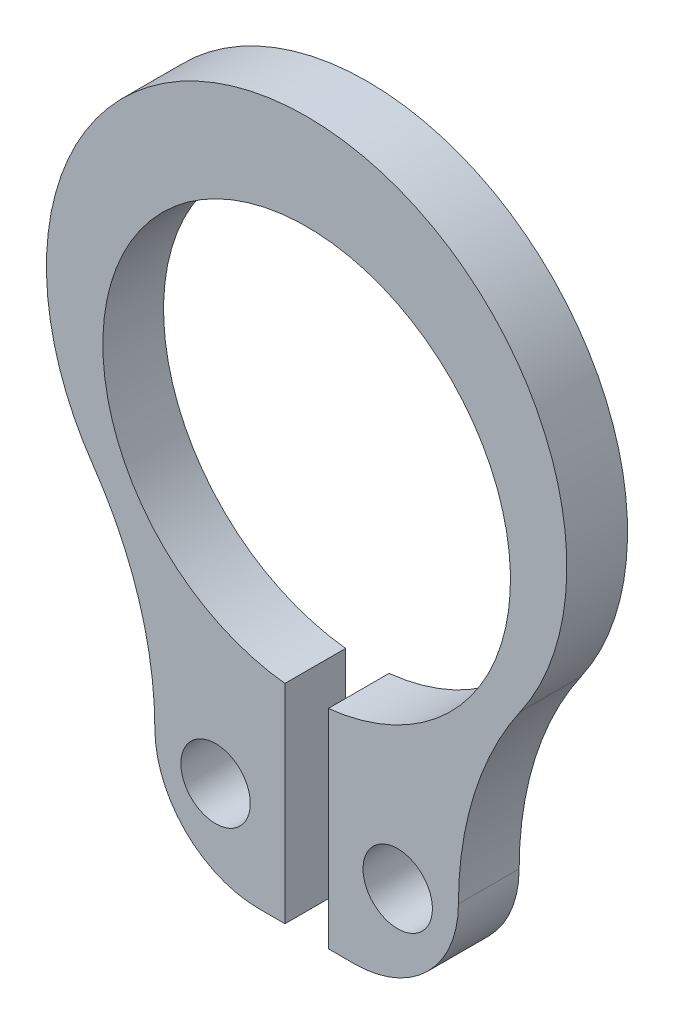
ISO-10303-21;
HEADER;
FILE_DESCRIPTION(('STEP AP214'),'2;1');
FILE_NAME('part.step','',(''),(''),'','','');
FILE_SCHEMA(('AUTOMOTIVE_DESIGN { 1 0 10303 214 1 1 1 1 }'));
ENDSEC;
DATA;
#1=APPLICATION_CONTEXT('core data for automotive mechanical design processes');
#2=APPLICATION_PROTOCOL_DEFINITION('international standard','automotive_design',2000,#1);
#3=PRODUCT_CONTEXT('',#1,'mechanical');
#4=PRODUCT('Part','Part','',(#3));
#5=PRODUCT_RELATED_PRODUCT_CATEGORY('part','',(#4));
#6=PRODUCT_DEFINITION_FORMATION('','',#4);
#7=PRODUCT_DEFINITION_CONTEXT('part definition',#1,'design');
#8=PRODUCT_DEFINITION('design','',#6,#7);
#9=PRODUCT_DEFINITION_SHAPE('','',#8);
#10=(LENGTH_UNIT() NAMED_UNIT(*) SI_UNIT(.MILLI.,.METRE.));
#11=(NAMED_UNIT(*) PLANE_ANGLE_UNIT() SI_UNIT($,.RADIAN.));
#12=(NAMED_UNIT(*) SI_UNIT($,.STERADIAN.) SOLID_ANGLE_UNIT());
#13=UNCERTAINTY_MEASURE_WITH_UNIT(LENGTH_MEASURE(1.E-05),#10,'distance_accuracy_value','');
#14=(GEOMETRIC_REPRESENTATION_CONTEXT(3) GLOBAL_UNCERTAINTY_ASSIGNED_CONTEXT((#13)) GLOBAL_UNIT_ASSIGNED_CONTEXT((#10,
#11,#12)) REPRESENTATION_CONTEXT('',''));
#15=CARTESIAN_POINT('',(0.,0.,0.));
#16=DIRECTION('',(0.,0.,1.));
#17=DIRECTION('',(1.,0.,0.));
#18=AXIS2_PLACEMENT_3D('',#15,#16,#17);
#19=CARTESIAN_POINT('',(0.,0.,0.7));
#20=DIRECTION('',(0.,0.,1.));
#21=DIRECTION('',(1.,0.,0.));
#22=AXIS2_PLACEMENT_3D('',#19,#20,#21);
#23=PLANE('',#22);
#24=CARTESIAN_POINT('',(1.05,-3.73666428910958,0.7));
#25=DIRECTION('',(0.,0.,1.));
#26=DIRECTION('',(1.,0.,0.));
#27=AXIS2_PLACEMENT_3D('',#24,#25,#26);
#28=CIRCLE('',#27,0.400000000000001);
#29=CARTESIAN_POINT('',(1.45,-3.73666428910958,0.7));
#30=VERTEX_POINT('',#29);
#31=EDGE_CURVE('E148',#30,#30,#28,.T.);
#32=ORIENTED_EDGE('',*,*,#31,.F.);
#33=EDGE_LOOP('',(#32));
#34=FACE_BOUND('',#33,.T.);
#35=CARTESIAN_POINT('',(0.,0.,0.7));
#36=DIRECTION('',(0.,0.,-1.));
#37=DIRECTION('',(1.,0.,0.));
#38=AXIS2_PLACEMENT_3D('',#35,#36,#37);
#39=CIRCLE('',#38,2.35);
#40=CARTESIAN_POINT('',(-0.25,-2.33666428910958,0.7));
#41=VERTEX_POINT('',#40);
#42=CARTESIAN_POINT('',(0.25,-2.33666428910958,0.7));
#43=VERTEX_POINT('',#42);
#44=EDGE_CURVE('E163',#41,#43,#39,.T.);
#45=ORIENTED_EDGE('',*,*,#44,.T.);
#46=DIRECTION('',(0.,-1.,0.));
#47=VECTOR('',#46,1.);
#48=CARTESIAN_POINT('',(0.25,-2.33666428910958,0.7));
#49=LINE('',#48,#47);
#50=CARTESIAN_POINT('',(0.250000000000001,-4.73666428910958,0.7));
#51=VERTEX_POINT('',#50);
#52=EDGE_CURVE('E101',#43,#51,#49,.T.);
#53=ORIENTED_EDGE('',*,*,#52,.T.);
#54=DIRECTION('',(1.,0.,0.));
#55=VECTOR('',#54,1.);
#56=CARTESIAN_POINT('',(0.250000000000001,-4.73666428910958,0.7));
#57=LINE('',#56,#55);
#58=CARTESIAN_POINT('',(0.55,-4.73666428910959,0.7));
#59=VERTEX_POINT('',#58);
#60=EDGE_CURVE('E184',#51,#59,#57,.T.);
#61=ORIENTED_EDGE('',*,*,#60,.T.);
#62=CARTESIAN_POINT('',(0.550000000000001,-3.53666428910959,0.7));
#63=DIRECTION('',(0.,0.,1.));
#64=DIRECTION('',(1.,0.,0.));
#65=AXIS2_PLACEMENT_3D('',#62,#63,#64);
#66=CIRCLE('',#65,1.2);
#67=CARTESIAN_POINT('',(1.74999932393386,-3.53793808590952,0.7));
#68=VERTEX_POINT('',#67);
#69=EDGE_CURVE('E203',#59,#68,#66,.T.);
#70=ORIENTED_EDGE('',*,*,#69,.T.);
#71=CARTESIAN_POINT('',(5.74999707038005,-3.54218407524264,0.7));
#72=DIRECTION('',(0.,0.,-1.));
#73=DIRECTION('',(-1.,0.,0.));
#74=AXIS2_PLACEMENT_3D('',#71,#72,#73);
#75=CIRCLE('',#74,4.);
#76=CARTESIAN_POINT('',(2.4642844587343,-1.26093603224685,0.7));
#77=VERTEX_POINT('',#76);
#78=EDGE_CURVE('E200',#68,#77,#75,.T.);
#79=ORIENTED_EDGE('',*,*,#78,.T.);
#80=CARTESIAN_POINT('',(0.,0.45,0.7));
#81=DIRECTION('',(0.,0.,1.));
#82=DIRECTION('',(1.,0.,0.));
#83=AXIS2_PLACEMENT_3D('',#80,#81,#82);
#84=CIRCLE('',#83,3.);
#85=CARTESIAN_POINT('',(-2.46428445873431,-1.26093603224685,0.7));
#86=VERTEX_POINT('',#85);
#87=EDGE_CURVE('E202',#77,#86,#84,.T.);
#88=ORIENTED_EDGE('',*,*,#87,.T.);
#89=CARTESIAN_POINT('',(-5.74999707038004,-3.54218407524264,0.7));
#90=DIRECTION('',(0.,0.,-1.));
#91=DIRECTION('',(1.,0.,0.));
#92=AXIS2_PLACEMENT_3D('',#89,#90,#91);
#93=CIRCLE('',#92,4.);
#94=CARTESIAN_POINT('',(-1.74999932393386,-3.53793808590952,0.7));
#95=VERTEX_POINT('',#94);
#96=EDGE_CURVE('E126',#86,#95,#93,.T.);
#97=ORIENTED_EDGE('',*,*,#96,.T.);
#98=CARTESIAN_POINT('',(-0.55,-3.53666428910959,0.7));
#99=DIRECTION('',(0.,0.,1.));
#100=DIRECTION('',(-1.,0.,0.));
#101=AXIS2_PLACEMENT_3D('',#98,#99,#100);
#102=CIRCLE('',#101,1.2);
#103=CARTESIAN_POINT('',(-0.550000000000001,-4.73666428910958,0.7));
#104=VERTEX_POINT('',#103);
#105=EDGE_CURVE('E120',#95,#104,#102,.T.);
#106=ORIENTED_EDGE('',*,*,#105,.T.);
#107=DIRECTION('',(1.,0.,0.));
#108=VECTOR('',#107,1.);
#109=CARTESIAN_POINT('',(-0.250000000000001,-4.73666428910958,0.7));
#110=LINE('',#109,#108);
#111=CARTESIAN_POINT('',(-0.250000000000001,-4.73666428910958,0.7));
#112=VERTEX_POINT('',#111);
#113=EDGE_CURVE('E124',#104,#112,#110,.T.);
#114=ORIENTED_EDGE('',*,*,#113,.T.);
#115=DIRECTION('',(0.,1.,0.));
#116=VECTOR('',#115,1.);
#117=CARTESIAN_POINT('',(-0.25,-2.33666428910958,0.7));
#118=LINE('',#117,#116);
#119=EDGE_CURVE('E52',#112,#41,#118,.T.);
#120=ORIENTED_EDGE('',*,*,#119,.T.);
#121=EDGE_LOOP('',(#45,#53,#61,#70,#79,#88,#97,#106,#114,#120));
#122=FACE_BOUND('',#121,.T.);
#123=CARTESIAN_POINT('',(-1.05,-3.73666428910958,0.7));
#124=DIRECTION('',(0.,0.,1.));
#125=DIRECTION('',(-1.,0.,0.));
#126=AXIS2_PLACEMENT_3D('',#123,#124,#125);
#127=CIRCLE('',#126,0.400000000000001);
#128=CARTESIAN_POINT('',(-1.45,-3.73666428910958,0.7));
#129=VERTEX_POINT('',#128);
#130=EDGE_CURVE('E214',#129,#129,#127,.T.);
#131=ORIENTED_EDGE('',*,*,#130,.F.);
#132=EDGE_LOOP('',(#131));
#133=FACE_BOUND('',#132,.T.);
#134=ADVANCED_FACE('F35',(#34,#122,#133),#23,.T.);
#135=CARTESIAN_POINT('',(0.,0.,0.));
#136=DIRECTION('',(0.,0.,1.));
#137=DIRECTION('',(1.,0.,0.));
#138=AXIS2_PLACEMENT_3D('',#135,#136,#137);
#139=PLANE('',#138);
#140=CARTESIAN_POINT('',(1.05,-3.73666428910958,0.));
#141=DIRECTION('',(0.,0.,1.));
#142=DIRECTION('',(1.,0.,0.));
#143=AXIS2_PLACEMENT_3D('',#140,#141,#142);
#144=CIRCLE('',#143,0.400000000000001);
#145=CARTESIAN_POINT('',(1.45,-3.73666428910958,0.));
#146=VERTEX_POINT('',#145);
#147=EDGE_CURVE('E211',#146,#146,#144,.T.);
#148=ORIENTED_EDGE('',*,*,#147,.T.);
#149=EDGE_LOOP('',(#148));
#150=FACE_BOUND('',#149,.T.);
#151=CARTESIAN_POINT('',(0.,0.,0.));
#152=DIRECTION('',(0.,0.,-1.));
#153=DIRECTION('',(1.,0.,0.));
#154=AXIS2_PLACEMENT_3D('',#151,#152,#153);
#155=CIRCLE('',#154,2.35);
#156=CARTESIAN_POINT('',(-0.25,-2.33666428910958,0.));
#157=VERTEX_POINT('',#156);
#158=CARTESIAN_POINT('',(0.25,-2.33666428910958,0.));
#159=VERTEX_POINT('',#158);
#160=EDGE_CURVE('E144',#157,#159,#155,.T.);
#161=ORIENTED_EDGE('',*,*,#160,.F.);
#162=DIRECTION('',(0.,1.,0.));
#163=VECTOR('',#162,1.);
#164=CARTESIAN_POINT('',(-0.25,-2.33666428910958,0.));
#165=LINE('',#164,#163);
#166=CARTESIAN_POINT('',(-0.250000000000001,-4.73666428910958,0.));
#167=VERTEX_POINT('',#166);
#168=EDGE_CURVE('E93',#167,#157,#165,.T.);
#169=ORIENTED_EDGE('',*,*,#168,.F.);
#170=DIRECTION('',(1.,0.,0.));
#171=VECTOR('',#170,1.);
#172=CARTESIAN_POINT('',(-0.250000000000001,-4.73666428910958,0.));
#173=LINE('',#172,#171);
#174=CARTESIAN_POINT('',(-0.550000000000001,-4.73666428910958,0.));
#175=VERTEX_POINT('',#174);
#176=EDGE_CURVE('E87',#175,#167,#173,.T.);
#177=ORIENTED_EDGE('',*,*,#176,.F.);
#178=CARTESIAN_POINT('',(-0.55,-3.53666428910959,0.));
#179=DIRECTION('',(0.,0.,1.));
#180=DIRECTION('',(-1.,0.,0.));
#181=AXIS2_PLACEMENT_3D('',#178,#179,#180);
#182=CIRCLE('',#181,1.2);
#183=CARTESIAN_POINT('',(-1.74999932393386,-3.53793808590952,0.));
#184=VERTEX_POINT('',#183);
#185=EDGE_CURVE('E134',#184,#175,#182,.T.);
#186=ORIENTED_EDGE('',*,*,#185,.F.);
#187=CARTESIAN_POINT('',(-5.74999707038004,-3.54218407524264,0.));
#188=DIRECTION('',(0.,0.,-1.));
#189=DIRECTION('',(1.,0.,0.));
#190=AXIS2_PLACEMENT_3D('',#187,#188,#189);
#191=CIRCLE('',#190,4.);
#192=CARTESIAN_POINT('',(-2.46428445873431,-1.26093603224685,0.));
#193=VERTEX_POINT('',#192);
#194=EDGE_CURVE('E158',#193,#184,#191,.T.);
#195=ORIENTED_EDGE('',*,*,#194,.F.);
#196=CARTESIAN_POINT('',(0.,0.45,0.));
#197=DIRECTION('',(0.,0.,1.));
#198=DIRECTION('',(1.,0.,0.));
#199=AXIS2_PLACEMENT_3D('',#196,#197,#198);
#200=CIRCLE('',#199,3.);
#201=CARTESIAN_POINT('',(2.4642844587343,-1.26093603224685,0.));
#202=VERTEX_POINT('',#201);
#203=EDGE_CURVE('E156',#202,#193,#200,.T.);
#204=ORIENTED_EDGE('',*,*,#203,.F.);
#205=CARTESIAN_POINT('',(5.74999707038005,-3.54218407524264,0.));
#206=DIRECTION('',(0.,0.,-1.));
#207=DIRECTION('',(-1.,0.,0.));
#208=AXIS2_PLACEMENT_3D('',#205,#206,#207);
#209=CIRCLE('',#208,4.);
#210=CARTESIAN_POINT('',(1.74999932393386,-3.53793808590952,0.));
#211=VERTEX_POINT('',#210);
#212=EDGE_CURVE('E154',#211,#202,#209,.T.);
#213=ORIENTED_EDGE('',*,*,#212,.F.);
#214=CARTESIAN_POINT('',(0.550000000000001,-3.53666428910959,0.));
#215=DIRECTION('',(0.,0.,1.));
#216=DIRECTION('',(1.,0.,0.));
#217=AXIS2_PLACEMENT_3D('',#214,#215,#216);
#218=CIRCLE('',#217,1.2);
#219=CARTESIAN_POINT('',(0.55,-4.73666428910959,0.));
#220=VERTEX_POINT('',#219);
#221=EDGE_CURVE('E152',#220,#211,#218,.T.);
#222=ORIENTED_EDGE('',*,*,#221,.F.);
#223=DIRECTION('',(1.,0.,0.));
#224=VECTOR('',#223,1.);
#225=CARTESIAN_POINT('',(0.250000000000001,-4.73666428910958,0.));
#226=LINE('',#225,#224);
#227=CARTESIAN_POINT('',(0.250000000000001,-4.73666428910958,0.));
#228=VERTEX_POINT('',#227);
#229=EDGE_CURVE('E150',#228,#220,#226,.T.);
#230=ORIENTED_EDGE('',*,*,#229,.F.);
#231=DIRECTION('',(0.,-1.,0.));
#232=VECTOR('',#231,1.);
#233=CARTESIAN_POINT('',(0.25,-2.33666428910958,0.));
#234=LINE('',#233,#232);
#235=EDGE_CURVE('E147',#159,#228,#234,.T.);
#236=ORIENTED_EDGE('',*,*,#235,.F.);
#237=EDGE_LOOP('',(#161,#169,#177,#186,#195,#204,#213,#222,#230,#236));
#238=FACE_BOUND('',#237,.T.);
#239=CARTESIAN_POINT('',(-1.05,-3.73666428910958,0.));
#240=DIRECTION('',(0.,0.,1.));
#241=DIRECTION('',(-1.,0.,0.));
#242=AXIS2_PLACEMENT_3D('',#239,#240,#241);
#243=CIRCLE('',#242,0.400000000000001);
#244=CARTESIAN_POINT('',(-1.45,-3.73666428910958,0.));
#245=VERTEX_POINT('',#244);
#246=EDGE_CURVE('E217',#245,#245,#243,.T.);
#247=ORIENTED_EDGE('',*,*,#246,.T.);
#248=EDGE_LOOP('',(#247));
#249=FACE_BOUND('',#248,.T.);
#250=ADVANCED_FACE('F188',(#150,#238,#249),#139,.F.);
#251=CARTESIAN_POINT('',(0.,0.,0.7));
#252=DIRECTION('',(0.,0.,-1.));
#253=DIRECTION('',(-1.,0.,0.));
#254=AXIS2_PLACEMENT_3D('',#251,#252,#253);
#255=CYLINDRICAL_SURFACE('',#254,2.35);
#256=ORIENTED_EDGE('',*,*,#160,.T.);
#257=DIRECTION('',(0.,0.,-1.));
#258=VECTOR('',#257,1.);
#259=CARTESIAN_POINT('',(0.25,-2.33666428910958,0.7));
#260=LINE('',#259,#258);
#261=EDGE_CURVE('E11',#43,#159,#260,.T.);
#262=ORIENTED_EDGE('',*,*,#261,.F.);
#263=ORIENTED_EDGE('',*,*,#44,.F.);
#264=DIRECTION('',(0.,0.,-1.));
#265=VECTOR('',#264,1.);
#266=CARTESIAN_POINT('',(-0.25,-2.33666428910958,0.7));
#267=LINE('',#266,#265);
#268=EDGE_CURVE('E140',#41,#157,#267,.T.);
#269=ORIENTED_EDGE('',*,*,#268,.T.);
#270=EDGE_LOOP('',(#256,#262,#263,#269));
#271=FACE_BOUND('',#270,.T.);
#272=ADVANCED_FACE('F37',(#271),#255,.F.);
#273=CARTESIAN_POINT('',(0.25,-2.33666428910958,0.7));
#274=DIRECTION('',(1.,0.,0.));
#275=DIRECTION('',(0.,1.,0.));
#276=AXIS2_PLACEMENT_3D('',#273,#274,#275);
#277=PLANE('',#276);
#278=ORIENTED_EDGE('',*,*,#235,.T.);
#279=DIRECTION('',(0.,0.,-1.));
#280=VECTOR('',#279,1.);
#281=CARTESIAN_POINT('',(0.250000000000001,-4.73666428910958,0.7));
#282=LINE('',#281,#280);
#283=EDGE_CURVE('E44',#51,#228,#282,.T.);
#284=ORIENTED_EDGE('',*,*,#283,.F.);
#285=ORIENTED_EDGE('',*,*,#52,.F.);
#286=ORIENTED_EDGE('',*,*,#261,.T.);
#287=EDGE_LOOP('',(#278,#284,#285,#286));
#288=FACE_BOUND('',#287,.T.);
#289=ADVANCED_FACE('F258',(#288),#277,.F.);
#290=CARTESIAN_POINT('',(0.250000000000001,-4.73666428910958,0.7));
#291=DIRECTION('',(0.,1.,0.));
#292=DIRECTION('',(-1.,0.,0.));
#293=AXIS2_PLACEMENT_3D('',#290,#291,#292);
#294=PLANE('',#293);
#295=ORIENTED_EDGE('',*,*,#229,.T.);
#296=DIRECTION('',(0.,0.,-1.));
#297=VECTOR('',#296,1.);
#298=CARTESIAN_POINT('',(0.55,-4.73666428910959,0.7));
#299=LINE('',#298,#297);
#300=EDGE_CURVE('E176',#59,#220,#299,.T.);
#301=ORIENTED_EDGE('',*,*,#300,.F.);
#302=ORIENTED_EDGE('',*,*,#60,.F.);
#303=ORIENTED_EDGE('',*,*,#283,.T.);
#304=EDGE_LOOP('',(#295,#301,#302,#303));
#305=FACE_BOUND('',#304,.T.);
#306=ADVANCED_FACE('F182',(#305),#294,.F.);
#307=CARTESIAN_POINT('',(0.550000000000001,-3.53666428910959,0.7));
#308=DIRECTION('',(0.,0.,-1.));
#309=DIRECTION('',(-1.,0.,0.));
#310=AXIS2_PLACEMENT_3D('',#307,#308,#309);
#311=CYLINDRICAL_SURFACE('',#310,1.2);
#312=ORIENTED_EDGE('',*,*,#221,.T.);
#313=DIRECTION('',(0.,0.,-1.));
#314=VECTOR('',#313,1.);
#315=CARTESIAN_POINT('',(1.74999932393386,-3.53793808590952,0.7));
#316=LINE('',#315,#314);
#317=EDGE_CURVE('E173',#68,#211,#316,.T.);
#318=ORIENTED_EDGE('',*,*,#317,.F.);
#319=ORIENTED_EDGE('',*,*,#69,.F.);
#320=ORIENTED_EDGE('',*,*,#300,.T.);
#321=EDGE_LOOP('',(#312,#318,#319,#320));
#322=FACE_BOUND('',#321,.T.);
#323=ADVANCED_FACE('F194',(#322),#311,.T.);
#324=CARTESIAN_POINT('',(5.74999707038005,-3.54218407524264,0.7));
#325=DIRECTION('',(0.,0.,-1.));
#326=DIRECTION('',(-1.,0.,0.));
#327=AXIS2_PLACEMENT_3D('',#324,#325,#326);
#328=CYLINDRICAL_SURFACE('',#327,4.);
#329=ORIENTED_EDGE('',*,*,#212,.T.);
#330=DIRECTION('',(0.,0.,-1.));
#331=VECTOR('',#330,1.);
#332=CARTESIAN_POINT('',(2.4642844587343,-1.26093603224685,0.7));
#333=LINE('',#332,#331);
#334=EDGE_CURVE('E170',#77,#202,#333,.T.);
#335=ORIENTED_EDGE('',*,*,#334,.F.);
#336=ORIENTED_EDGE('',*,*,#78,.F.);
#337=ORIENTED_EDGE('',*,*,#317,.T.);
#338=EDGE_LOOP('',(#329,#335,#336,#337));
#339=FACE_BOUND('',#338,.T.);
#340=ADVANCED_FACE('F198',(#339),#328,.F.);
#341=CARTESIAN_POINT('',(0.,0.45,0.7));
#342=DIRECTION('',(0.,0.,-1.));
#343=DIRECTION('',(-1.,0.,0.));
#344=AXIS2_PLACEMENT_3D('',#341,#342,#343);
#345=CYLINDRICAL_SURFACE('',#344,3.);
#346=ORIENTED_EDGE('',*,*,#203,.T.);
#347=DIRECTION('',(0.,0.,-1.));
#348=VECTOR('',#347,1.);
#349=CARTESIAN_POINT('',(-2.46428445873431,-1.26093603224685,0.7));
#350=LINE('',#349,#348);
#351=EDGE_CURVE('E167',#86,#193,#350,.T.);
#352=ORIENTED_EDGE('',*,*,#351,.F.);
#353=ORIENTED_EDGE('',*,*,#87,.F.);
#354=ORIENTED_EDGE('',*,*,#334,.T.);
#355=EDGE_LOOP('',(#346,#352,#353,#354));
#356=FACE_BOUND('',#355,.T.);
#357=ADVANCED_FACE('F248',(#356),#345,.T.);
#358=CARTESIAN_POINT('',(-5.74999707038004,-3.54218407524264,0.7));
#359=DIRECTION('',(0.,0.,-1.));
#360=DIRECTION('',(-1.,0.,0.));
#361=AXIS2_PLACEMENT_3D('',#358,#359,#360);
#362=CYLINDRICAL_SURFACE('',#361,4.);
#363=ORIENTED_EDGE('',*,*,#194,.T.);
#364=DIRECTION('',(0.,0.,-1.));
#365=VECTOR('',#364,1.);
#366=CARTESIAN_POINT('',(-1.74999932393386,-3.53793808590952,0.7));
#367=LINE('',#366,#365);
#368=EDGE_CURVE('E135',#95,#184,#367,.T.);
#369=ORIENTED_EDGE('',*,*,#368,.F.);
#370=ORIENTED_EDGE('',*,*,#96,.F.);
#371=ORIENTED_EDGE('',*,*,#351,.T.);
#372=EDGE_LOOP('',(#363,#369,#370,#371));
#373=FACE_BOUND('',#372,.T.);
#374=ADVANCED_FACE('F245',(#373),#362,.F.);
#375=CARTESIAN_POINT('',(-0.55,-3.53666428910959,0.7));
#376=DIRECTION('',(0.,0.,-1.));
#377=DIRECTION('',(-1.,0.,0.));
#378=AXIS2_PLACEMENT_3D('',#375,#376,#377);
#379=CYLINDRICAL_SURFACE('',#378,1.2);
#380=ORIENTED_EDGE('',*,*,#185,.T.);
#381=DIRECTION('',(0.,0.,-1.));
#382=VECTOR('',#381,1.);
#383=CARTESIAN_POINT('',(-0.550000000000001,-4.73666428910958,0.7));
#384=LINE('',#383,#382);
#385=EDGE_CURVE('E131',#104,#175,#384,.T.);
#386=ORIENTED_EDGE('',*,*,#385,.F.);
#387=ORIENTED_EDGE('',*,*,#105,.F.);
#388=ORIENTED_EDGE('',*,*,#368,.T.);
#389=EDGE_LOOP('',(#380,#386,#387,#388));
#390=FACE_BOUND('',#389,.T.);
#391=ADVANCED_FACE('F132',(#390),#379,.T.);
#392=CARTESIAN_POINT('',(-0.250000000000001,-4.73666428910958,0.7));
#393=DIRECTION('',(0.,1.,0.));
#394=DIRECTION('',(-1.,0.,0.));
#395=AXIS2_PLACEMENT_3D('',#392,#393,#394);
#396=PLANE('',#395);
#397=ORIENTED_EDGE('',*,*,#176,.T.);
#398=DIRECTION('',(0.,0.,-1.));
#399=VECTOR('',#398,1.);
#400=CARTESIAN_POINT('',(-0.250000000000001,-4.73666428910958,0.7));
#401=LINE('',#400,#399);
#402=EDGE_CURVE('E136',#112,#167,#401,.T.);
#403=ORIENTED_EDGE('',*,*,#402,.F.);
#404=ORIENTED_EDGE('',*,*,#113,.F.);
#405=ORIENTED_EDGE('',*,*,#385,.T.);
#406=EDGE_LOOP('',(#397,#403,#404,#405));
#407=FACE_BOUND('',#406,.T.);
#408=ADVANCED_FACE('F138',(#407),#396,.F.);
#409=CARTESIAN_POINT('',(-0.25,-2.33666428910958,0.7));
#410=DIRECTION('',(-1.,0.,0.));
#411=DIRECTION('',(0.,-1.,0.));
#412=AXIS2_PLACEMENT_3D('',#409,#410,#411);
#413=PLANE('',#412);
#414=ORIENTED_EDGE('',*,*,#168,.T.);
#415=ORIENTED_EDGE('',*,*,#268,.F.);
#416=ORIENTED_EDGE('',*,*,#119,.F.);
#417=ORIENTED_EDGE('',*,*,#402,.T.);
#418=EDGE_LOOP('',(#414,#415,#416,#417));
#419=FACE_BOUND('',#418,.T.);
#420=ADVANCED_FACE('F238',(#419),#413,.F.);
#421=CARTESIAN_POINT('',(1.05,-3.73666428910958,0.7));
#422=DIRECTION('',(0.,0.,-1.));
#423=DIRECTION('',(-1.,0.,0.));
#424=AXIS2_PLACEMENT_3D('',#421,#422,#423);
#425=CYLINDRICAL_SURFACE('',#424,0.400000000000001);
#426=ORIENTED_EDGE('',*,*,#31,.T.);
#427=EDGE_LOOP('',(#426));
#428=FACE_BOUND('',#427,.T.);
#429=ORIENTED_EDGE('',*,*,#147,.F.);
#430=EDGE_LOOP('',(#429));
#431=FACE_BOUND('',#430,.T.);
#432=ADVANCED_FACE('F235',(#428,#431),#425,.F.);
#433=CARTESIAN_POINT('',(-1.05,-3.73666428910958,0.7));
#434=DIRECTION('',(0.,0.,-1.));
#435=DIRECTION('',(-1.,0.,0.));
#436=AXIS2_PLACEMENT_3D('',#433,#434,#435);
#437=CYLINDRICAL_SURFACE('',#436,0.400000000000001);
#438=ORIENTED_EDGE('',*,*,#130,.T.);
#439=EDGE_LOOP('',(#438));
#440=FACE_BOUND('',#439,.T.);
#441=ORIENTED_EDGE('',*,*,#246,.F.);
#442=EDGE_LOOP('',(#441));
#443=FACE_BOUND('',#442,.T.);
#444=ADVANCED_FACE('F223',(#440,#443),#437,.F.);
#445=CLOSED_SHELL('',(#134,#250,#272,#289,#306,#323,#340,#357,#374,#391,#408,#420,#432,#444));
#446=MANIFOLD_SOLID_BREP('B2',#445);
#447=ADVANCED_BREP_SHAPE_REPRESENTATION('',(#18,#446),#14);
#448=SHAPE_DEFINITION_REPRESENTATION(#9,#447);
ENDSEC;
END-ISO-10303-21;
